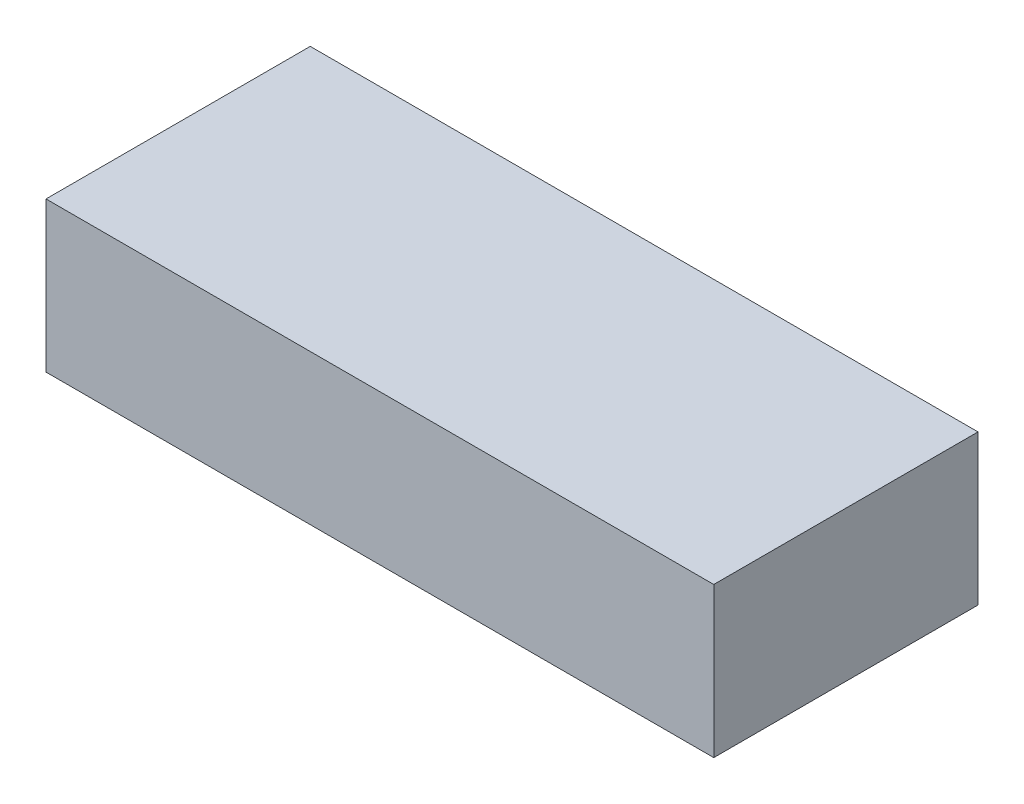
ISO-10303-21;
HEADER;
FILE_DESCRIPTION(('STEP AP214'),'2;1');
FILE_NAME('part.step','',(''),(''),'','','');
FILE_SCHEMA(('AUTOMOTIVE_DESIGN { 1 0 10303 214 1 1 1 1 }'));
ENDSEC;
DATA;
#1=APPLICATION_CONTEXT('core data for automotive mechanical design processes');
#2=APPLICATION_PROTOCOL_DEFINITION('international standard','automotive_design',2000,#1);
#3=PRODUCT_CONTEXT('',#1,'mechanical');
#4=PRODUCT('Part','Part','',(#3));
#5=PRODUCT_RELATED_PRODUCT_CATEGORY('part','',(#4));
#6=PRODUCT_DEFINITION_FORMATION('','',#4);
#7=PRODUCT_DEFINITION_CONTEXT('part definition',#1,'design');
#8=PRODUCT_DEFINITION('design','',#6,#7);
#9=PRODUCT_DEFINITION_SHAPE('','',#8);
#10=(LENGTH_UNIT() NAMED_UNIT(*) SI_UNIT(.MILLI.,.METRE.));
#11=(NAMED_UNIT(*) PLANE_ANGLE_UNIT() SI_UNIT($,.RADIAN.));
#12=(NAMED_UNIT(*) SI_UNIT($,.STERADIAN.) SOLID_ANGLE_UNIT());
#13=UNCERTAINTY_MEASURE_WITH_UNIT(LENGTH_MEASURE(1.E-05),#10,'distance_accuracy_value','');
#14=(GEOMETRIC_REPRESENTATION_CONTEXT(3) GLOBAL_UNCERTAINTY_ASSIGNED_CONTEXT((#13)) GLOBAL_UNIT_ASSIGNED_CONTEXT((#10,
#11,#12)) REPRESENTATION_CONTEXT('',''));
#15=CARTESIAN_POINT('',(0.,0.,0.));
#16=DIRECTION('',(0.,0.,1.));
#17=DIRECTION('',(1.,0.,0.));
#18=AXIS2_PLACEMENT_3D('',#15,#16,#17);
#19=CARTESIAN_POINT('',(467.5,-210.,1.1327982892113E-13));
#20=DIRECTION('',(1.,0.,0.));
#21=DIRECTION('',(0.,0.,-1.));
#22=AXIS2_PLACEMENT_3D('',#19,#20,#21);
#23=PLANE('',#22);
#24=DIRECTION('',(0.,0.,-1.));
#25=VECTOR('',#24,1.);
#26=CARTESIAN_POINT('',(467.5,0.,1.1327982892113E-13));
#27=LINE('',#26,#25);
#28=CARTESIAN_POINT('',(467.5,0.,1.1327982892113E-13));
#29=VERTEX_POINT('',#28);
#30=CARTESIAN_POINT('',(467.5,0.,-370.));
#31=VERTEX_POINT('',#30);
#32=EDGE_CURVE('E99',#29,#31,#27,.T.);
#33=ORIENTED_EDGE('',*,*,#32,.F.);
#34=DIRECTION('',(0.,1.,0.));
#35=VECTOR('',#34,1.);
#36=CARTESIAN_POINT('',(467.5,-210.,1.1327982892113E-13));
#37=LINE('',#36,#35);
#38=CARTESIAN_POINT('',(467.5,-210.,1.1327982892113E-13));
#39=VERTEX_POINT('',#38);
#40=EDGE_CURVE('E11',#39,#29,#37,.T.);
#41=ORIENTED_EDGE('',*,*,#40,.F.);
#42=DIRECTION('',(0.,0.,-1.));
#43=VECTOR('',#42,1.);
#44=CARTESIAN_POINT('',(467.5,-210.,1.1327982892113E-13));
#45=LINE('',#44,#43);
#46=CARTESIAN_POINT('',(467.5,-210.,-370.));
#47=VERTEX_POINT('',#46);
#48=EDGE_CURVE('E93',#39,#47,#45,.T.);
#49=ORIENTED_EDGE('',*,*,#48,.T.);
#50=DIRECTION('',(0.,1.,0.));
#51=VECTOR('',#50,1.);
#52=CARTESIAN_POINT('',(467.5,-210.,-370.));
#53=LINE('',#52,#51);
#54=EDGE_CURVE('E38',#47,#31,#53,.T.);
#55=ORIENTED_EDGE('',*,*,#54,.T.);
#56=EDGE_LOOP('',(#33,#41,#49,#55));
#57=FACE_BOUND('',#56,.T.);
#58=ADVANCED_FACE('F35',(#57),#23,.T.);
#59=CARTESIAN_POINT('',(467.5,-210.,1.1327982892113E-13));
#60=DIRECTION('',(0.,0.,1.));
#61=DIRECTION('',(1.,0.,0.));
#62=AXIS2_PLACEMENT_3D('',#59,#60,#61);
#63=PLANE('',#62);
#64=DIRECTION('',(1.,0.,0.));
#65=VECTOR('',#64,1.);
#66=CARTESIAN_POINT('',(467.5,0.,1.1327982892113E-13));
#67=LINE('',#66,#65);
#68=CARTESIAN_POINT('',(-467.5,0.,1.1327982892113E-13));
#69=VERTEX_POINT('',#68);
#70=EDGE_CURVE('E95',#69,#29,#67,.T.);
#71=ORIENTED_EDGE('',*,*,#70,.F.);
#72=DIRECTION('',(0.,1.,0.));
#73=VECTOR('',#72,1.);
#74=CARTESIAN_POINT('',(-467.5,-210.,1.1327982892113E-13));
#75=LINE('',#74,#73);
#76=CARTESIAN_POINT('',(-467.5,-210.,1.1327982892113E-13));
#77=VERTEX_POINT('',#76);
#78=EDGE_CURVE('E44',#77,#69,#75,.T.);
#79=ORIENTED_EDGE('',*,*,#78,.F.);
#80=DIRECTION('',(1.,0.,0.));
#81=VECTOR('',#80,1.);
#82=CARTESIAN_POINT('',(467.5,-210.,1.1327982892113E-13));
#83=LINE('',#82,#81);
#84=EDGE_CURVE('E90',#77,#39,#83,.T.);
#85=ORIENTED_EDGE('',*,*,#84,.T.);
#86=ORIENTED_EDGE('',*,*,#40,.T.);
#87=EDGE_LOOP('',(#71,#79,#85,#86));
#88=FACE_BOUND('',#87,.T.);
#89=ADVANCED_FACE('F109',(#88),#63,.T.);
#90=CARTESIAN_POINT('',(-467.5,-210.,1.1327982892113E-13));
#91=DIRECTION('',(-1.,0.,0.));
#92=DIRECTION('',(0.,0.,1.));
#93=AXIS2_PLACEMENT_3D('',#90,#91,#92);
#94=PLANE('',#93);
#95=DIRECTION('',(0.,0.,1.));
#96=VECTOR('',#95,1.);
#97=CARTESIAN_POINT('',(-467.5,0.,1.1327982892113E-13));
#98=LINE('',#97,#96);
#99=CARTESIAN_POINT('',(-467.5,0.,-370.));
#100=VERTEX_POINT('',#99);
#101=EDGE_CURVE('E85',#100,#69,#98,.T.);
#102=ORIENTED_EDGE('',*,*,#101,.F.);
#103=DIRECTION('',(0.,1.,0.));
#104=VECTOR('',#103,1.);
#105=CARTESIAN_POINT('',(-467.5,-210.,-370.));
#106=LINE('',#105,#104);
#107=CARTESIAN_POINT('',(-467.5,-210.,-370.));
#108=VERTEX_POINT('',#107);
#109=EDGE_CURVE('E80',#108,#100,#106,.T.);
#110=ORIENTED_EDGE('',*,*,#109,.F.);
#111=DIRECTION('',(0.,0.,1.));
#112=VECTOR('',#111,1.);
#113=CARTESIAN_POINT('',(-467.5,-210.,1.1327982892113E-13));
#114=LINE('',#113,#112);
#115=EDGE_CURVE('E83',#108,#77,#114,.T.);
#116=ORIENTED_EDGE('',*,*,#115,.T.);
#117=ORIENTED_EDGE('',*,*,#78,.T.);
#118=EDGE_LOOP('',(#102,#110,#116,#117));
#119=FACE_BOUND('',#118,.T.);
#120=ADVANCED_FACE('F82',(#119),#94,.T.);
#121=CARTESIAN_POINT('',(467.5,-210.,-370.));
#122=DIRECTION('',(0.,0.,-1.));
#123=DIRECTION('',(-1.,0.,0.));
#124=AXIS2_PLACEMENT_3D('',#121,#122,#123);
#125=PLANE('',#124);
#126=DIRECTION('',(-1.,0.,0.));
#127=VECTOR('',#126,1.);
#128=CARTESIAN_POINT('',(467.5,0.,-370.));
#129=LINE('',#128,#127);
#130=EDGE_CURVE('E102',#31,#100,#129,.T.);
#131=ORIENTED_EDGE('',*,*,#130,.F.);
#132=ORIENTED_EDGE('',*,*,#54,.F.);
#133=DIRECTION('',(-1.,0.,0.));
#134=VECTOR('',#133,1.);
#135=CARTESIAN_POINT('',(467.5,-210.,-370.));
#136=LINE('',#135,#134);
#137=EDGE_CURVE('E89',#47,#108,#136,.T.);
#138=ORIENTED_EDGE('',*,*,#137,.T.);
#139=ORIENTED_EDGE('',*,*,#109,.T.);
#140=EDGE_LOOP('',(#131,#132,#138,#139));
#141=FACE_BOUND('',#140,.T.);
#142=ADVANCED_FACE('F92',(#141),#125,.T.);
#143=CARTESIAN_POINT('',(0.,-210.,0.));
#144=DIRECTION('',(0.,1.,0.));
#145=DIRECTION('',(0.,0.,1.));
#146=AXIS2_PLACEMENT_3D('',#143,#144,#145);
#147=PLANE('',#146);
#148=ORIENTED_EDGE('',*,*,#48,.F.);
#149=ORIENTED_EDGE('',*,*,#84,.F.);
#150=ORIENTED_EDGE('',*,*,#115,.F.);
#151=ORIENTED_EDGE('',*,*,#137,.F.);
#152=EDGE_LOOP('',(#148,#149,#150,#151));
#153=FACE_BOUND('',#152,.T.);
#154=ADVANCED_FACE('F88',(#153),#147,.F.);
#155=CARTESIAN_POINT('',(0.,0.,0.));
#156=DIRECTION('',(0.,1.,0.));
#157=DIRECTION('',(0.,0.,1.));
#158=AXIS2_PLACEMENT_3D('',#155,#156,#157);
#159=PLANE('',#158);
#160=ORIENTED_EDGE('',*,*,#32,.T.);
#161=ORIENTED_EDGE('',*,*,#130,.T.);
#162=ORIENTED_EDGE('',*,*,#101,.T.);
#163=ORIENTED_EDGE('',*,*,#70,.T.);
#164=EDGE_LOOP('',(#160,#161,#162,#163));
#165=FACE_BOUND('',#164,.T.);
#166=ADVANCED_FACE('F108',(#165),#159,.T.);
#167=CLOSED_SHELL('',(#58,#89,#120,#142,#154,#166));
#168=MANIFOLD_SOLID_BREP('B2',#167);
#169=ADVANCED_BREP_SHAPE_REPRESENTATION('',(#18,#168),#14);
#170=SHAPE_DEFINITION_REPRESENTATION(#9,#169);
ENDSEC;
END-ISO-10303-21;
